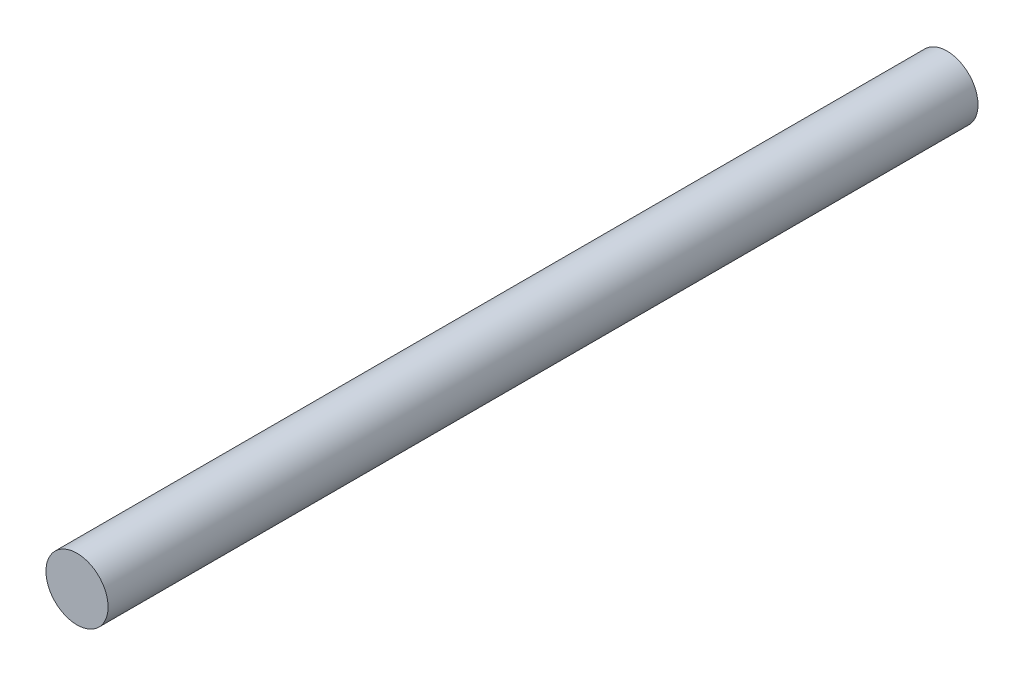
ISO-10303-21;
HEADER;
FILE_DESCRIPTION(('STEP AP214'),'2;1');
FILE_NAME('part.step','',(''),(''),'','','');
FILE_SCHEMA(('AUTOMOTIVE_DESIGN { 1 0 10303 214 1 1 1 1 }'));
ENDSEC;
DATA;
#1=APPLICATION_CONTEXT('core data for automotive mechanical design processes');
#2=APPLICATION_PROTOCOL_DEFINITION('international standard','automotive_design',2000,#1);
#3=PRODUCT_CONTEXT('',#1,'mechanical');
#4=PRODUCT('Part','Part','',(#3));
#5=PRODUCT_RELATED_PRODUCT_CATEGORY('part','',(#4));
#6=PRODUCT_DEFINITION_FORMATION('','',#4);
#7=PRODUCT_DEFINITION_CONTEXT('part definition',#1,'design');
#8=PRODUCT_DEFINITION('design','',#6,#7);
#9=PRODUCT_DEFINITION_SHAPE('','',#8);
#10=(LENGTH_UNIT() NAMED_UNIT(*) SI_UNIT(.MILLI.,.METRE.));
#11=(NAMED_UNIT(*) PLANE_ANGLE_UNIT() SI_UNIT($,.RADIAN.));
#12=(NAMED_UNIT(*) SI_UNIT($,.STERADIAN.) SOLID_ANGLE_UNIT());
#13=UNCERTAINTY_MEASURE_WITH_UNIT(LENGTH_MEASURE(1.E-05),#10,'distance_accuracy_value','');
#14=(GEOMETRIC_REPRESENTATION_CONTEXT(3) GLOBAL_UNCERTAINTY_ASSIGNED_CONTEXT((#13)) GLOBAL_UNIT_ASSIGNED_CONTEXT((#10,
#11,#12)) REPRESENTATION_CONTEXT('',''));
#15=CARTESIAN_POINT('',(0.,0.,0.));
#16=DIRECTION('',(0.,0.,1.));
#17=DIRECTION('',(1.,0.,0.));
#18=AXIS2_PLACEMENT_3D('',#15,#16,#17);
#19=CARTESIAN_POINT('',(0.,0.,140.));
#20=DIRECTION('',(0.,0.,-1.));
#21=DIRECTION('',(-1.,0.,0.));
#22=AXIS2_PLACEMENT_3D('',#19,#20,#21);
#23=CYLINDRICAL_SURFACE('',#22,5.);
#24=CARTESIAN_POINT('',(0.,0.,140.));
#25=DIRECTION('',(0.,0.,1.));
#26=DIRECTION('',(1.,0.,0.));
#27=AXIS2_PLACEMENT_3D('',#24,#25,#26);
#28=CIRCLE('',#27,5.);
#29=CARTESIAN_POINT('',(5.,0.,140.));
#30=VERTEX_POINT('',#29);
#31=EDGE_CURVE('E10',#30,#30,#28,.T.);
#32=ORIENTED_EDGE('',*,*,#31,.F.);
#33=EDGE_LOOP('',(#32));
#34=FACE_BOUND('',#33,.T.);
#35=CARTESIAN_POINT('',(0.,0.,0.));
#36=DIRECTION('',(0.,0.,1.));
#37=DIRECTION('',(1.,0.,0.));
#38=AXIS2_PLACEMENT_3D('',#35,#36,#37);
#39=CIRCLE('',#38,5.);
#40=CARTESIAN_POINT('',(5.,0.,0.));
#41=VERTEX_POINT('',#40);
#42=EDGE_CURVE('E46',#41,#41,#39,.T.);
#43=ORIENTED_EDGE('',*,*,#42,.T.);
#44=EDGE_LOOP('',(#43));
#45=FACE_BOUND('',#44,.T.);
#46=ADVANCED_FACE('F43',(#34,#45),#23,.T.);
#47=CARTESIAN_POINT('',(0.,0.,140.));
#48=DIRECTION('',(0.,0.,1.));
#49=DIRECTION('',(1.,0.,0.));
#50=AXIS2_PLACEMENT_3D('',#47,#48,#49);
#51=PLANE('',#50);
#52=ORIENTED_EDGE('',*,*,#31,.T.);
#53=EDGE_LOOP('',(#52));
#54=FACE_BOUND('',#53,.T.);
#55=ADVANCED_FACE('F58',(#54),#51,.T.);
#56=CARTESIAN_POINT('',(0.,0.,0.));
#57=DIRECTION('',(0.,0.,1.));
#58=DIRECTION('',(1.,0.,0.));
#59=AXIS2_PLACEMENT_3D('',#56,#57,#58);
#60=PLANE('',#59);
#61=ORIENTED_EDGE('',*,*,#42,.F.);
#62=EDGE_LOOP('',(#61));
#63=FACE_BOUND('',#62,.T.);
#64=ADVANCED_FACE('F59',(#63),#60,.F.);
#65=CLOSED_SHELL('',(#46,#55,#64));
#66=MANIFOLD_SOLID_BREP('B2',#65);
#67=ADVANCED_BREP_SHAPE_REPRESENTATION('',(#18,#66),#14);
#68=SHAPE_DEFINITION_REPRESENTATION(#9,#67);
ENDSEC;
END-ISO-10303-21;
